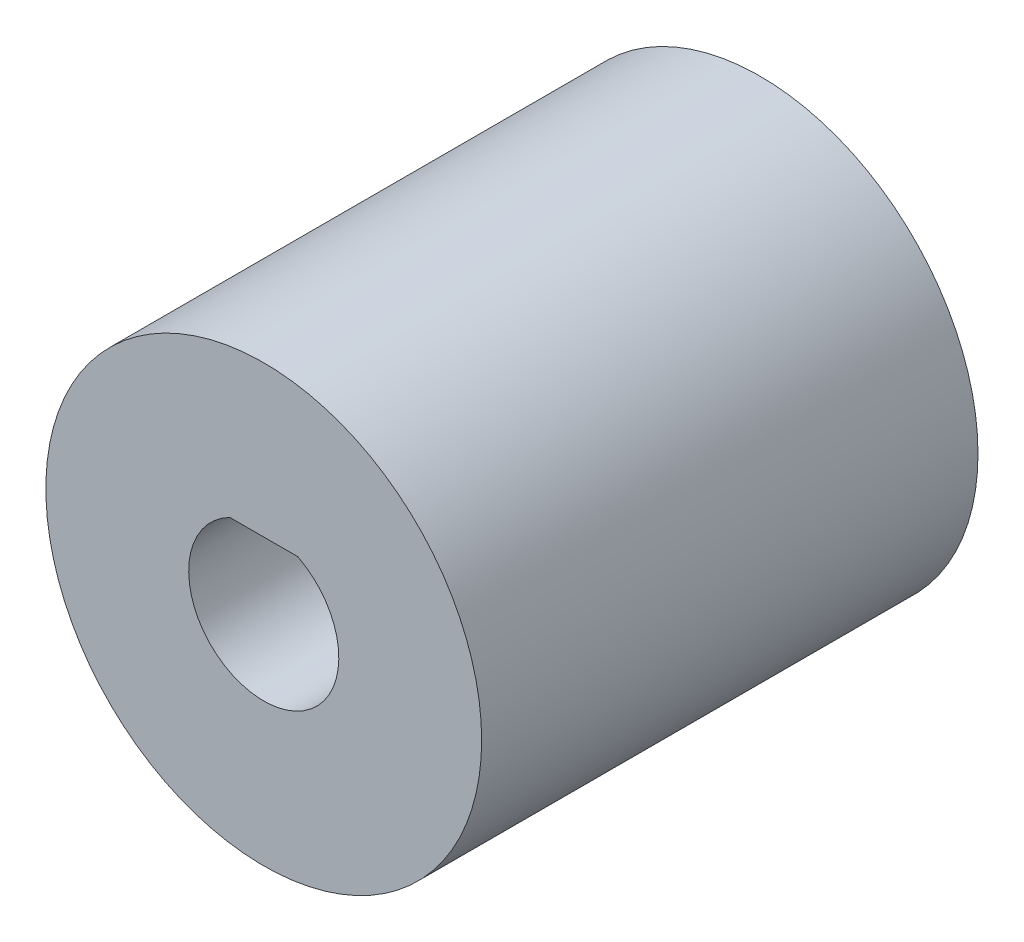
ISO-10303-21;
HEADER;
FILE_DESCRIPTION(('STEP AP214'),'2;1');
FILE_NAME('part.step','',(''),(''),'','','');
FILE_SCHEMA(('AUTOMOTIVE_DESIGN { 1 0 10303 214 1 1 1 1 }'));
ENDSEC;
DATA;
#1=APPLICATION_CONTEXT('core data for automotive mechanical design processes');
#2=APPLICATION_PROTOCOL_DEFINITION('international standard','automotive_design',2000,#1);
#3=PRODUCT_CONTEXT('',#1,'mechanical');
#4=PRODUCT('Part','Part','',(#3));
#5=PRODUCT_RELATED_PRODUCT_CATEGORY('part','',(#4));
#6=PRODUCT_DEFINITION_FORMATION('','',#4);
#7=PRODUCT_DEFINITION_CONTEXT('part definition',#1,'design');
#8=PRODUCT_DEFINITION('design','',#6,#7);
#9=PRODUCT_DEFINITION_SHAPE('','',#8);
#10=(LENGTH_UNIT() NAMED_UNIT(*) SI_UNIT(.MILLI.,.METRE.));
#11=(NAMED_UNIT(*) PLANE_ANGLE_UNIT() SI_UNIT($,.RADIAN.));
#12=(NAMED_UNIT(*) SI_UNIT($,.STERADIAN.) SOLID_ANGLE_UNIT());
#13=UNCERTAINTY_MEASURE_WITH_UNIT(LENGTH_MEASURE(1.E-05),#10,'distance_accuracy_value','');
#14=(GEOMETRIC_REPRESENTATION_CONTEXT(3) GLOBAL_UNCERTAINTY_ASSIGNED_CONTEXT((#13)) GLOBAL_UNIT_ASSIGNED_CONTEXT((#10,
#11,#12)) REPRESENTATION_CONTEXT('',''));
#15=CARTESIAN_POINT('',(0.,0.,0.));
#16=DIRECTION('',(0.,0.,1.));
#17=DIRECTION('',(1.,0.,0.));
#18=AXIS2_PLACEMENT_3D('',#15,#16,#17);
#19=CARTESIAN_POINT('',(0.,0.,0.));
#20=DIRECTION('',(0.,0.,1.));
#21=DIRECTION('',(1.,0.,0.));
#22=AXIS2_PLACEMENT_3D('',#19,#20,#21);
#23=PLANE('',#22);
#24=CARTESIAN_POINT('',(0.,0.,0.));
#25=DIRECTION('',(0.,0.,1.));
#26=DIRECTION('',(1.,0.,0.));
#27=AXIS2_PLACEMENT_3D('',#24,#25,#26);
#28=CIRCLE('',#27,9.);
#29=CARTESIAN_POINT('',(9.,0.,0.));
#30=VERTEX_POINT('',#29);
#31=EDGE_CURVE('E11',#30,#30,#28,.T.);
#32=ORIENTED_EDGE('',*,*,#31,.F.);
#33=EDGE_LOOP('',(#32));
#34=FACE_BOUND('',#33,.T.);
#35=CARTESIAN_POINT('',(0.,0.,0.));
#36=DIRECTION('',(0.,0.,1.));
#37=DIRECTION('',(1.,0.,0.));
#38=AXIS2_PLACEMENT_3D('',#35,#36,#37);
#39=CIRCLE('',#38,6.);
#40=CARTESIAN_POINT('',(6.,0.,0.));
#41=VERTEX_POINT('',#40);
#42=EDGE_CURVE('E43',#41,#41,#39,.T.);
#43=ORIENTED_EDGE('',*,*,#42,.T.);
#44=EDGE_LOOP('',(#43));
#45=FACE_BOUND('',#44,.T.);
#46=ADVANCED_FACE('F35',(#34,#45),#23,.F.);
#47=CARTESIAN_POINT('',(0.,0.,0.5));
#48=DIRECTION('',(0.,0.,-1.));
#49=DIRECTION('',(-1.,0.,0.));
#50=AXIS2_PLACEMENT_3D('',#47,#48,#49);
#51=CYLINDRICAL_SURFACE('',#50,9.);
#52=ORIENTED_EDGE('',*,*,#31,.T.);
#53=EDGE_LOOP('',(#52));
#54=FACE_BOUND('',#53,.T.);
#55=CARTESIAN_POINT('',(0.,0.,20.5));
#56=DIRECTION('',(0.,0.,1.));
#57=DIRECTION('',(1.,0.,0.));
#58=AXIS2_PLACEMENT_3D('',#55,#56,#57);
#59=CIRCLE('',#58,9.);
#60=CARTESIAN_POINT('',(9.,0.,20.5));
#61=VERTEX_POINT('',#60);
#62=EDGE_CURVE('E72',#61,#61,#59,.T.);
#63=ORIENTED_EDGE('',*,*,#62,.F.);
#64=EDGE_LOOP('',(#63));
#65=FACE_BOUND('',#64,.T.);
#66=ADVANCED_FACE('F37',(#54,#65),#51,.T.);
#67=CARTESIAN_POINT('',(0.,0.,0.5));
#68=DIRECTION('',(0.,0.,-1.));
#69=DIRECTION('',(-1.,0.,0.));
#70=AXIS2_PLACEMENT_3D('',#67,#68,#69);
#71=CYLINDRICAL_SURFACE('',#70,6.);
#72=CARTESIAN_POINT('',(0.,0.,0.5));
#73=DIRECTION('',(0.,0.,1.));
#74=DIRECTION('',(1.,0.,0.));
#75=AXIS2_PLACEMENT_3D('',#72,#73,#74);
#76=CIRCLE('',#75,6.);
#77=CARTESIAN_POINT('',(6.,0.,0.5));
#78=VERTEX_POINT('',#77);
#79=EDGE_CURVE('E84',#78,#78,#76,.T.);
#80=ORIENTED_EDGE('',*,*,#79,.T.);
#81=EDGE_LOOP('',(#80));
#82=FACE_BOUND('',#81,.T.);
#83=ORIENTED_EDGE('',*,*,#42,.F.);
#84=EDGE_LOOP('',(#83));
#85=FACE_BOUND('',#84,.T.);
#86=ADVANCED_FACE('F90',(#82,#85),#71,.F.);
#87=CARTESIAN_POINT('',(0.,0.,0.5));
#88=DIRECTION('',(0.,0.,1.));
#89=DIRECTION('',(1.,0.,0.));
#90=AXIS2_PLACEMENT_3D('',#87,#88,#89);
#91=PLANE('',#90);
#92=CARTESIAN_POINT('',(0.,0.,0.5));
#93=DIRECTION('',(0.,0.,1.));
#94=DIRECTION('',(1.,0.,0.));
#95=AXIS2_PLACEMENT_3D('',#92,#93,#94);
#96=CIRCLE('',#95,3.1);
#97=CARTESIAN_POINT('',(-1.4,2.76586333718787,0.5));
#98=VERTEX_POINT('',#97);
#99=CARTESIAN_POINT('',(1.4,2.76586333718787,0.5));
#100=VERTEX_POINT('',#99);
#101=EDGE_CURVE('E57',#98,#100,#96,.T.);
#102=ORIENTED_EDGE('',*,*,#101,.T.);
#103=DIRECTION('',(-1.,0.,0.));
#104=VECTOR('',#103,1.);
#105=CARTESIAN_POINT('',(-1.4,2.76586333718787,0.5));
#106=LINE('',#105,#104);
#107=EDGE_CURVE('E63',#100,#98,#106,.T.);
#108=ORIENTED_EDGE('',*,*,#107,.T.);
#109=EDGE_LOOP('',(#102,#108));
#110=FACE_BOUND('',#109,.T.);
#111=ORIENTED_EDGE('',*,*,#79,.F.);
#112=EDGE_LOOP('',(#111));
#113=FACE_BOUND('',#112,.T.);
#114=ADVANCED_FACE('F74',(#110,#113),#91,.F.);
#115=CARTESIAN_POINT('',(0.,0.,20.5));
#116=DIRECTION('',(0.,0.,1.));
#117=DIRECTION('',(1.,0.,0.));
#118=AXIS2_PLACEMENT_3D('',#115,#116,#117);
#119=PLANE('',#118);
#120=ORIENTED_EDGE('',*,*,#62,.T.);
#121=EDGE_LOOP('',(#120));
#122=FACE_BOUND('',#121,.T.);
#123=DIRECTION('',(-1.,0.,0.));
#124=VECTOR('',#123,1.);
#125=CARTESIAN_POINT('',(-1.4,2.76586333718787,20.5));
#126=LINE('',#125,#124);
#127=CARTESIAN_POINT('',(1.4,2.76586333718787,20.5));
#128=VERTEX_POINT('',#127);
#129=CARTESIAN_POINT('',(-1.4,2.76586333718787,20.5));
#130=VERTEX_POINT('',#129);
#131=EDGE_CURVE('E78',#128,#130,#126,.T.);
#132=ORIENTED_EDGE('',*,*,#131,.F.);
#133=CARTESIAN_POINT('',(0.,0.,20.5));
#134=DIRECTION('',(0.,0.,1.));
#135=DIRECTION('',(1.,0.,0.));
#136=AXIS2_PLACEMENT_3D('',#133,#134,#135);
#137=CIRCLE('',#136,3.1);
#138=EDGE_CURVE('E67',#130,#128,#137,.T.);
#139=ORIENTED_EDGE('',*,*,#138,.F.);
#140=EDGE_LOOP('',(#132,#139));
#141=FACE_BOUND('',#140,.T.);
#142=ADVANCED_FACE('F98',(#122,#141),#119,.T.);
#143=CARTESIAN_POINT('',(0.,0.,20.5));
#144=DIRECTION('',(0.,0.,-1.));
#145=DIRECTION('',(-1.,0.,0.));
#146=AXIS2_PLACEMENT_3D('',#143,#144,#145);
#147=CYLINDRICAL_SURFACE('',#146,3.1);
#148=ORIENTED_EDGE('',*,*,#101,.F.);
#149=DIRECTION('',(0.,0.,-1.));
#150=VECTOR('',#149,1.);
#151=CARTESIAN_POINT('',(-1.4,2.76586333718787,20.5));
#152=LINE('',#151,#150);
#153=EDGE_CURVE('E65',#130,#98,#152,.T.);
#154=ORIENTED_EDGE('',*,*,#153,.F.);
#155=ORIENTED_EDGE('',*,*,#138,.T.);
#156=DIRECTION('',(0.,0.,-1.));
#157=VECTOR('',#156,1.);
#158=CARTESIAN_POINT('',(1.4,2.76586333718787,20.5));
#159=LINE('',#158,#157);
#160=EDGE_CURVE('E50',#128,#100,#159,.T.);
#161=ORIENTED_EDGE('',*,*,#160,.T.);
#162=EDGE_LOOP('',(#148,#154,#155,#161));
#163=FACE_BOUND('',#162,.T.);
#164=ADVANCED_FACE('F69',(#163),#147,.F.);
#165=CARTESIAN_POINT('',(-1.4,2.76586333718787,20.5));
#166=DIRECTION('',(0.,-1.,0.));
#167=DIRECTION('',(0.,0.,-1.));
#168=AXIS2_PLACEMENT_3D('',#165,#166,#167);
#169=PLANE('',#168);
#170=ORIENTED_EDGE('',*,*,#107,.F.);
#171=ORIENTED_EDGE('',*,*,#160,.F.);
#172=ORIENTED_EDGE('',*,*,#131,.T.);
#173=ORIENTED_EDGE('',*,*,#153,.T.);
#174=EDGE_LOOP('',(#170,#171,#172,#173));
#175=FACE_BOUND('',#174,.T.);
#176=ADVANCED_FACE('F64',(#175),#169,.T.);
#177=CLOSED_SHELL('',(#46,#66,#86,#114,#142,#164,#176));
#178=MANIFOLD_SOLID_BREP('B2',#177);
#179=ADVANCED_BREP_SHAPE_REPRESENTATION('',(#18,#178),#14);
#180=SHAPE_DEFINITION_REPRESENTATION(#9,#179);
ENDSEC;
END-ISO-10303-21;
